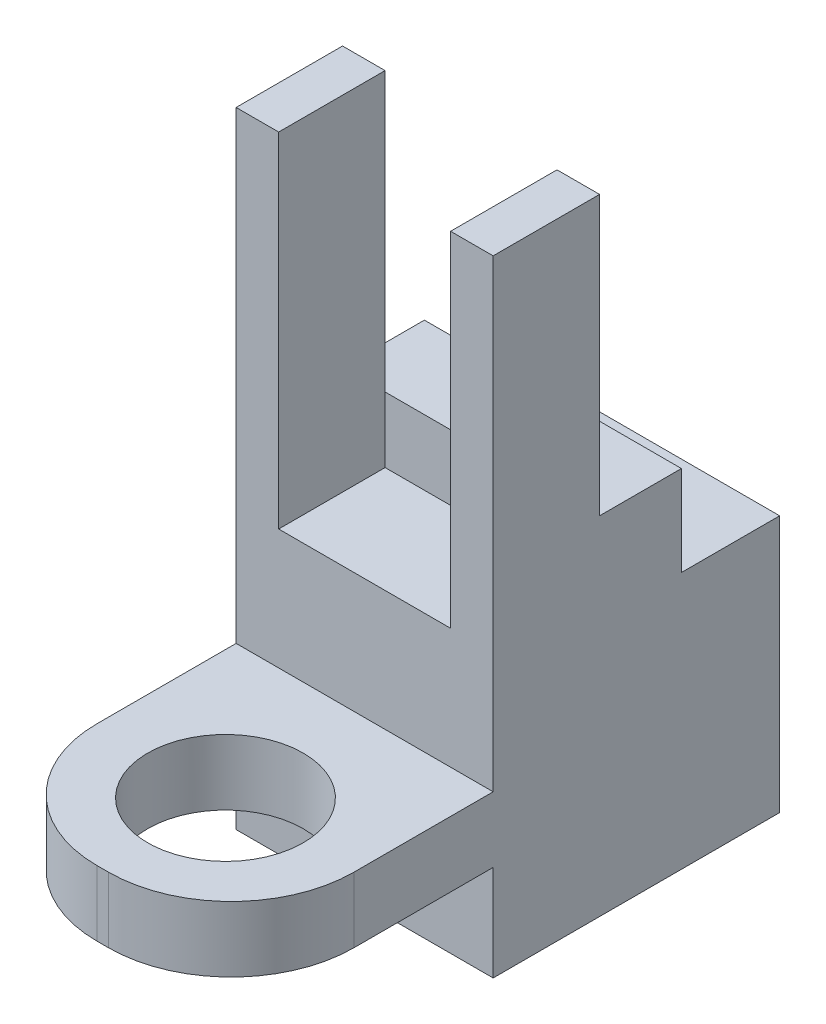
ISO-10303-21;
HEADER;
FILE_DESCRIPTION(('STEP AP214'),'2;1');
FILE_NAME('part.step','',(''),(''),'','','');
FILE_SCHEMA(('AUTOMOTIVE_DESIGN { 1 0 10303 214 1 1 1 1 }'));
ENDSEC;
DATA;
#1=APPLICATION_CONTEXT('core data for automotive mechanical design processes');
#2=APPLICATION_PROTOCOL_DEFINITION('international standard','automotive_design',2000,#1);
#3=PRODUCT_CONTEXT('',#1,'mechanical');
#4=PRODUCT('Part','Part','',(#3));
#5=PRODUCT_RELATED_PRODUCT_CATEGORY('part','',(#4));
#6=PRODUCT_DEFINITION_FORMATION('','',#4);
#7=PRODUCT_DEFINITION_CONTEXT('part definition',#1,'design');
#8=PRODUCT_DEFINITION('design','',#6,#7);
#9=PRODUCT_DEFINITION_SHAPE('','',#8);
#10=(LENGTH_UNIT() NAMED_UNIT(*) SI_UNIT(.MILLI.,.METRE.));
#11=(NAMED_UNIT(*) PLANE_ANGLE_UNIT() SI_UNIT($,.RADIAN.));
#12=(NAMED_UNIT(*) SI_UNIT($,.STERADIAN.) SOLID_ANGLE_UNIT());
#13=UNCERTAINTY_MEASURE_WITH_UNIT(LENGTH_MEASURE(1.E-05),#10,'distance_accuracy_value','');
#14=(GEOMETRIC_REPRESENTATION_CONTEXT(3) GLOBAL_UNCERTAINTY_ASSIGNED_CONTEXT((#13)) GLOBAL_UNIT_ASSIGNED_CONTEXT((#10,
#11,#12)) REPRESENTATION_CONTEXT('',''));
#15=CARTESIAN_POINT('',(0.,0.,0.));
#16=DIRECTION('',(0.,0.,1.));
#17=DIRECTION('',(1.,0.,0.));
#18=AXIS2_PLACEMENT_3D('',#15,#16,#17);
#19=CARTESIAN_POINT('',(15.7,26.7,22.));
#20=DIRECTION('',(0.,0.,-1.));
#21=DIRECTION('',(-1.,0.,0.));
#22=AXIS2_PLACEMENT_3D('',#19,#20,#21);
#23=PLANE('',#22);
#24=DIRECTION('',(0.,-1.,0.));
#25=VECTOR('',#24,1.);
#26=CARTESIAN_POINT('',(10.5,60.7,22.));
#27=LINE('',#26,#25);
#28=CARTESIAN_POINT('',(10.5,26.7,22.));
#29=VERTEX_POINT('',#28);
#30=CARTESIAN_POINT('',(10.5,18.7,22.));
#31=VERTEX_POINT('',#30);
#32=EDGE_CURVE('E239',#29,#31,#27,.T.);
#33=ORIENTED_EDGE('',*,*,#32,.F.);
#34=DIRECTION('',(1.,0.,0.));
#35=VECTOR('',#34,1.);
#36=CARTESIAN_POINT('',(15.7,26.7,22.));
#37=LINE('',#36,#35);
#38=CARTESIAN_POINT('',(-10.5,26.7,22.));
#39=VERTEX_POINT('',#38);
#40=EDGE_CURVE('E259',#39,#29,#37,.T.);
#41=ORIENTED_EDGE('',*,*,#40,.F.);
#42=DIRECTION('',(0.,-1.,0.));
#43=VECTOR('',#42,1.);
#44=CARTESIAN_POINT('',(-10.5,60.7,22.));
#45=LINE('',#44,#43);
#46=CARTESIAN_POINT('',(-10.5,18.7,22.));
#47=VERTEX_POINT('',#46);
#48=EDGE_CURVE('E252',#39,#47,#45,.T.);
#49=ORIENTED_EDGE('',*,*,#48,.T.);
#50=DIRECTION('',(-1.,0.,0.));
#51=VECTOR('',#50,1.);
#52=CARTESIAN_POINT('',(-10.5,18.7,22.));
#53=LINE('',#52,#51);
#54=EDGE_CURVE('E209',#31,#47,#53,.T.);
#55=ORIENTED_EDGE('',*,*,#54,.F.);
#56=EDGE_LOOP('',(#33,#41,#49,#55));
#57=FACE_BOUND('',#56,.T.);
#58=ADVANCED_FACE('F35',(#57),#23,.F.);
#59=CARTESIAN_POINT('',(-15.7,15.7,30.));
#60=DIRECTION('',(0.,-1.,0.));
#61=DIRECTION('',(0.,0.,-1.));
#62=AXIS2_PLACEMENT_3D('',#59,#60,#61);
#63=PLANE('',#62);
#64=DIRECTION('',(-1.,0.,0.));
#65=VECTOR('',#64,1.);
#66=CARTESIAN_POINT('',(-15.7,15.7,12.));
#67=LINE('',#66,#65);
#68=CARTESIAN_POINT('',(15.7,15.7,12.));
#69=VERTEX_POINT('',#68);
#70=CARTESIAN_POINT('',(-15.7,15.7,12.));
#71=VERTEX_POINT('',#70);
#72=EDGE_CURVE('E254',#69,#71,#67,.T.);
#73=ORIENTED_EDGE('',*,*,#72,.F.);
#74=DIRECTION('',(0.,0.,-1.));
#75=VECTOR('',#74,1.);
#76=CARTESIAN_POINT('',(15.7,15.7,30.));
#77=LINE('',#76,#75);
#78=CARTESIAN_POINT('',(15.7,15.7,0.));
#79=VERTEX_POINT('',#78);
#80=EDGE_CURVE('E373',#69,#79,#77,.T.);
#81=ORIENTED_EDGE('',*,*,#80,.T.);
#82=DIRECTION('',(-1.,0.,0.));
#83=VECTOR('',#82,1.);
#84=CARTESIAN_POINT('',(-15.7,15.7,0.));
#85=LINE('',#84,#83);
#86=CARTESIAN_POINT('',(-15.7,15.7,0.));
#87=VERTEX_POINT('',#86);
#88=EDGE_CURVE('E368',#79,#87,#85,.T.);
#89=ORIENTED_EDGE('',*,*,#88,.T.);
#90=DIRECTION('',(0.,0.,-1.));
#91=VECTOR('',#90,1.);
#92=CARTESIAN_POINT('',(-15.7,15.7,30.));
#93=LINE('',#92,#91);
#94=EDGE_CURVE('E371',#71,#87,#93,.T.);
#95=ORIENTED_EDGE('',*,*,#94,.F.);
#96=EDGE_LOOP('',(#73,#81,#89,#95));
#97=FACE_BOUND('',#96,.T.);
#98=ADVANCED_FACE('F390',(#97),#63,.F.);
#99=CARTESIAN_POINT('',(0.,0.,35.));
#100=DIRECTION('',(0.,0.,-1.));
#101=DIRECTION('',(-1.,0.,0.));
#102=AXIS2_PLACEMENT_3D('',#99,#100,#101);
#103=PLANE('',#102);
#104=DIRECTION('',(1.,0.,0.));
#105=VECTOR('',#104,1.);
#106=CARTESIAN_POINT('',(10.5,18.7,35.));
#107=LINE('',#106,#105);
#108=CARTESIAN_POINT('',(-10.5,18.7,35.));
#109=VERTEX_POINT('',#108);
#110=CARTESIAN_POINT('',(10.5,18.7,35.));
#111=VERTEX_POINT('',#110);
#112=EDGE_CURVE('E207',#109,#111,#107,.T.);
#113=ORIENTED_EDGE('',*,*,#112,.F.);
#114=DIRECTION('',(0.,1.,0.));
#115=VECTOR('',#114,1.);
#116=CARTESIAN_POINT('',(-10.5,60.7,35.));
#117=LINE('',#116,#115);
#118=CARTESIAN_POINT('',(-10.5,60.7,35.));
#119=VERTEX_POINT('',#118);
#120=EDGE_CURVE('E191',#109,#119,#117,.T.);
#121=ORIENTED_EDGE('',*,*,#120,.T.);
#122=DIRECTION('',(-1.,0.,0.));
#123=VECTOR('',#122,1.);
#124=CARTESIAN_POINT('',(-15.7,60.7,35.));
#125=LINE('',#124,#123);
#126=CARTESIAN_POINT('',(-15.7,60.7,35.));
#127=VERTEX_POINT('',#126);
#128=EDGE_CURVE('E200',#119,#127,#125,.T.);
#129=ORIENTED_EDGE('',*,*,#128,.T.);
#130=DIRECTION('',(0.,-1.,0.));
#131=VECTOR('',#130,1.);
#132=CARTESIAN_POINT('',(-15.7,-15.7,35.));
#133=LINE('',#132,#131);
#134=CARTESIAN_POINT('',(-15.7,4.,35.));
#135=VERTEX_POINT('',#134);
#136=EDGE_CURVE('E318',#127,#135,#133,.T.);
#137=ORIENTED_EDGE('',*,*,#136,.T.);
#138=DIRECTION('',(-1.,0.,0.));
#139=VECTOR('',#138,1.);
#140=CARTESIAN_POINT('',(-15.7,4.,35.));
#141=LINE('',#140,#139);
#142=CARTESIAN_POINT('',(15.7,4.,35.));
#143=VERTEX_POINT('',#142);
#144=EDGE_CURVE('E58',#143,#135,#141,.T.);
#145=ORIENTED_EDGE('',*,*,#144,.F.);
#146=DIRECTION('',(0.,1.,0.));
#147=VECTOR('',#146,1.);
#148=CARTESIAN_POINT('',(15.7,15.7,35.));
#149=LINE('',#148,#147);
#150=CARTESIAN_POINT('',(15.7,60.7,35.));
#151=VERTEX_POINT('',#150);
#152=EDGE_CURVE('E323',#143,#151,#149,.T.);
#153=ORIENTED_EDGE('',*,*,#152,.T.);
#154=DIRECTION('',(-1.,0.,0.));
#155=VECTOR('',#154,1.);
#156=CARTESIAN_POINT('',(10.5,60.7,35.));
#157=LINE('',#156,#155);
#158=CARTESIAN_POINT('',(10.5,60.7,35.));
#159=VERTEX_POINT('',#158);
#160=EDGE_CURVE('E226',#151,#159,#157,.T.);
#161=ORIENTED_EDGE('',*,*,#160,.T.);
#162=DIRECTION('',(0.,-1.,0.));
#163=VECTOR('',#162,1.);
#164=CARTESIAN_POINT('',(10.5,20.7,35.));
#165=LINE('',#164,#163);
#166=EDGE_CURVE('E201',#159,#111,#165,.T.);
#167=ORIENTED_EDGE('',*,*,#166,.T.);
#168=EDGE_LOOP('',(#113,#121,#129,#137,#145,#153,#161,#167));
#169=FACE_BOUND('',#168,.T.);
#170=ADVANCED_FACE('F211',(#169),#103,.F.);
#171=DIRECTION('',(1.,0.,0.));
#172=VECTOR('',#171,1.);
#173=CARTESIAN_POINT('',(15.7,-4.,35.));
#174=LINE('',#173,#172);
#175=CARTESIAN_POINT('',(-15.7,-4.,35.));
#176=VERTEX_POINT('',#175);
#177=CARTESIAN_POINT('',(15.7,-4.,35.));
#178=VERTEX_POINT('',#177);
#179=EDGE_CURVE('E295',#176,#178,#174,.T.);
#180=ORIENTED_EDGE('',*,*,#179,.F.);
#181=CARTESIAN_POINT('',(-15.7,-15.7,35.));
#182=VERTEX_POINT('',#181);
#183=EDGE_CURVE('E317',#176,#182,#133,.T.);
#184=ORIENTED_EDGE('',*,*,#183,.T.);
#185=DIRECTION('',(1.,0.,0.));
#186=VECTOR('',#185,1.);
#187=CARTESIAN_POINT('',(15.7,-15.7,35.));
#188=LINE('',#187,#186);
#189=CARTESIAN_POINT('',(15.7,-15.7,35.));
#190=VERTEX_POINT('',#189);
#191=EDGE_CURVE('E320',#182,#190,#188,.T.);
#192=ORIENTED_EDGE('',*,*,#191,.T.);
#193=EDGE_CURVE('E324',#190,#178,#149,.T.);
#194=ORIENTED_EDGE('',*,*,#193,.T.);
#195=EDGE_LOOP('',(#180,#184,#192,#194));
#196=FACE_BOUND('',#195,.T.);
#197=ADVANCED_FACE('F474',(#196),#103,.F.);
#198=CARTESIAN_POINT('',(0.,0.,0.));
#199=DIRECTION('',(0.,0.,1.));
#200=DIRECTION('',(1.,0.,0.));
#201=AXIS2_PLACEMENT_3D('',#198,#199,#200);
#202=PLANE('',#201);
#203=DIRECTION('',(0.,-1.,0.));
#204=VECTOR('',#203,1.);
#205=CARTESIAN_POINT('',(-15.7,15.7,0.));
#206=LINE('',#205,#204);
#207=CARTESIAN_POINT('',(-15.7,-15.7,0.));
#208=VERTEX_POINT('',#207);
#209=EDGE_CURVE('E360',#87,#208,#206,.T.);
#210=ORIENTED_EDGE('',*,*,#209,.F.);
#211=ORIENTED_EDGE('',*,*,#88,.F.);
#212=DIRECTION('',(0.,1.,0.));
#213=VECTOR('',#212,1.);
#214=CARTESIAN_POINT('',(15.7,15.7,0.));
#215=LINE('',#214,#213);
#216=CARTESIAN_POINT('',(15.7,-15.7,0.));
#217=VERTEX_POINT('',#216);
#218=EDGE_CURVE('E365',#217,#79,#215,.T.);
#219=ORIENTED_EDGE('',*,*,#218,.F.);
#220=DIRECTION('',(1.,0.,0.));
#221=VECTOR('',#220,1.);
#222=CARTESIAN_POINT('',(-15.7,-15.7,0.));
#223=LINE('',#222,#221);
#224=EDGE_CURVE('E363',#208,#217,#223,.T.);
#225=ORIENTED_EDGE('',*,*,#224,.F.);
#226=EDGE_LOOP('',(#210,#211,#219,#225));
#227=FACE_BOUND('',#226,.T.);
#228=DIRECTION('',(-1.,0.,0.));
#229=VECTOR('',#228,1.);
#230=CARTESIAN_POINT('',(-12.7,12.7,0.));
#231=LINE('',#230,#229);
#232=CARTESIAN_POINT('',(12.7,12.7,0.));
#233=VERTEX_POINT('',#232);
#234=CARTESIAN_POINT('',(-12.7,12.7,0.));
#235=VERTEX_POINT('',#234);
#236=EDGE_CURVE('E326',#233,#235,#231,.T.);
#237=ORIENTED_EDGE('',*,*,#236,.T.);
#238=DIRECTION('',(0.,-1.,0.));
#239=VECTOR('',#238,1.);
#240=CARTESIAN_POINT('',(-12.7,12.7,0.));
#241=LINE('',#240,#239);
#242=CARTESIAN_POINT('',(-12.7,-12.7,0.));
#243=VERTEX_POINT('',#242);
#244=EDGE_CURVE('E343',#235,#243,#241,.T.);
#245=ORIENTED_EDGE('',*,*,#244,.T.);
#246=DIRECTION('',(1.,0.,0.));
#247=VECTOR('',#246,1.);
#248=CARTESIAN_POINT('',(-12.7,-12.7,0.));
#249=LINE('',#248,#247);
#250=CARTESIAN_POINT('',(12.7,-12.7,0.));
#251=VERTEX_POINT('',#250);
#252=EDGE_CURVE('E346',#243,#251,#249,.T.);
#253=ORIENTED_EDGE('',*,*,#252,.T.);
#254=DIRECTION('',(0.,1.,0.));
#255=VECTOR('',#254,1.);
#256=CARTESIAN_POINT('',(12.7,12.7,0.));
#257=LINE('',#256,#255);
#258=EDGE_CURVE('E331',#251,#233,#257,.T.);
#259=ORIENTED_EDGE('',*,*,#258,.T.);
#260=EDGE_LOOP('',(#237,#245,#253,#259));
#261=FACE_BOUND('',#260,.T.);
#262=ADVANCED_FACE('F385',(#227,#261),#202,.F.);
#263=CARTESIAN_POINT('',(-15.7,15.7,30.));
#264=DIRECTION('',(1.,0.,0.));
#265=DIRECTION('',(0.,1.,0.));
#266=AXIS2_PLACEMENT_3D('',#263,#264,#265);
#267=PLANE('',#266);
#268=ORIENTED_EDGE('',*,*,#136,.F.);
#269=DIRECTION('',(0.,0.,1.));
#270=VECTOR('',#269,1.);
#271=CARTESIAN_POINT('',(-15.7,60.7,32.));
#272=LINE('',#271,#270);
#273=CARTESIAN_POINT('',(-15.7,60.7,22.));
#274=VERTEX_POINT('',#273);
#275=EDGE_CURVE('E243',#274,#127,#272,.T.);
#276=ORIENTED_EDGE('',*,*,#275,.F.);
#277=DIRECTION('',(0.,-1.,0.));
#278=VECTOR('',#277,1.);
#279=CARTESIAN_POINT('',(-15.7,60.7,22.));
#280=LINE('',#279,#278);
#281=CARTESIAN_POINT('',(-15.7,26.7,22.));
#282=VERTEX_POINT('',#281);
#283=EDGE_CURVE('E249',#274,#282,#280,.T.);
#284=ORIENTED_EDGE('',*,*,#283,.T.);
#285=DIRECTION('',(0.,0.,1.));
#286=VECTOR('',#285,1.);
#287=CARTESIAN_POINT('',(-15.7,26.7,22.));
#288=LINE('',#287,#286);
#289=CARTESIAN_POINT('',(-15.7,26.7,12.));
#290=VERTEX_POINT('',#289);
#291=EDGE_CURVE('E264',#290,#282,#288,.T.);
#292=ORIENTED_EDGE('',*,*,#291,.F.);
#293=DIRECTION('',(0.,-1.,0.));
#294=VECTOR('',#293,1.);
#295=CARTESIAN_POINT('',(-15.7,26.7,12.));
#296=LINE('',#295,#294);
#297=EDGE_CURVE('E267',#290,#71,#296,.T.);
#298=ORIENTED_EDGE('',*,*,#297,.T.);
#299=ORIENTED_EDGE('',*,*,#94,.T.);
#300=ORIENTED_EDGE('',*,*,#209,.T.);
#301=DIRECTION('',(0.,0.,-1.));
#302=VECTOR('',#301,1.);
#303=CARTESIAN_POINT('',(-15.7,-15.7,30.));
#304=LINE('',#303,#302);
#305=EDGE_CURVE('E11',#182,#208,#304,.T.);
#306=ORIENTED_EDGE('',*,*,#305,.F.);
#307=ORIENTED_EDGE('',*,*,#183,.F.);
#308=DIRECTION('',(0.,0.,-1.));
#309=VECTOR('',#308,1.);
#310=CARTESIAN_POINT('',(-15.7,-4.,40.));
#311=LINE('',#310,#309);
#312=CARTESIAN_POINT('',(-15.7,-4.,52.));
#313=VERTEX_POINT('',#312);
#314=EDGE_CURVE('E314',#313,#176,#311,.T.);
#315=ORIENTED_EDGE('',*,*,#314,.F.);
#316=DIRECTION('',(0.,-1.,0.));
#317=VECTOR('',#316,1.);
#318=CARTESIAN_POINT('',(-15.7,4.,52.));
#319=LINE('',#318,#317);
#320=CARTESIAN_POINT('',(-15.7,4.,52.));
#321=VERTEX_POINT('',#320);
#322=EDGE_CURVE('E292',#321,#313,#319,.T.);
#323=ORIENTED_EDGE('',*,*,#322,.F.);
#324=DIRECTION('',(0.,0.,-1.));
#325=VECTOR('',#324,1.);
#326=CARTESIAN_POINT('',(-15.7,4.,40.));
#327=LINE('',#326,#325);
#328=EDGE_CURVE('E305',#321,#135,#327,.T.);
#329=ORIENTED_EDGE('',*,*,#328,.T.);
#330=EDGE_LOOP('',(#268,#276,#284,#292,#298,#299,#300,#306,#307,#315,#323,#329));
#331=FACE_BOUND('',#330,.T.);
#332=ADVANCED_FACE('F37',(#331),#267,.F.);
#333=CARTESIAN_POINT('',(-15.7,-15.7,30.));
#334=DIRECTION('',(0.,1.,0.));
#335=DIRECTION('',(0.,0.,1.));
#336=AXIS2_PLACEMENT_3D('',#333,#334,#335);
#337=PLANE('',#336);
#338=ORIENTED_EDGE('',*,*,#224,.T.);
#339=DIRECTION('',(0.,0.,-1.));
#340=VECTOR('',#339,1.);
#341=CARTESIAN_POINT('',(15.7,-15.7,30.));
#342=LINE('',#341,#340);
#343=EDGE_CURVE('E43',#190,#217,#342,.T.);
#344=ORIENTED_EDGE('',*,*,#343,.F.);
#345=ORIENTED_EDGE('',*,*,#191,.F.);
#346=ORIENTED_EDGE('',*,*,#305,.T.);
#347=EDGE_LOOP('',(#338,#344,#345,#346));
#348=FACE_BOUND('',#347,.T.);
#349=ADVANCED_FACE('F497',(#348),#337,.F.);
#350=CARTESIAN_POINT('',(15.7,15.7,30.));
#351=DIRECTION('',(-1.,0.,0.));
#352=DIRECTION('',(0.,-1.,0.));
#353=AXIS2_PLACEMENT_3D('',#350,#351,#352);
#354=PLANE('',#353);
#355=ORIENTED_EDGE('',*,*,#80,.F.);
#356=DIRECTION('',(0.,-1.,0.));
#357=VECTOR('',#356,1.);
#358=CARTESIAN_POINT('',(15.7,26.7,12.));
#359=LINE('',#358,#357);
#360=CARTESIAN_POINT('',(15.7,26.7,12.));
#361=VERTEX_POINT('',#360);
#362=EDGE_CURVE('E271',#361,#69,#359,.T.);
#363=ORIENTED_EDGE('',*,*,#362,.F.);
#364=DIRECTION('',(0.,0.,-1.));
#365=VECTOR('',#364,1.);
#366=CARTESIAN_POINT('',(15.7,26.7,12.));
#367=LINE('',#366,#365);
#368=CARTESIAN_POINT('',(15.7,26.7,22.));
#369=VERTEX_POINT('',#368);
#370=EDGE_CURVE('E258',#369,#361,#367,.T.);
#371=ORIENTED_EDGE('',*,*,#370,.F.);
#372=DIRECTION('',(0.,-1.,0.));
#373=VECTOR('',#372,1.);
#374=CARTESIAN_POINT('',(15.7,60.7,22.));
#375=LINE('',#374,#373);
#376=CARTESIAN_POINT('',(15.7,60.7,22.));
#377=VERTEX_POINT('',#376);
#378=EDGE_CURVE('E237',#377,#369,#375,.T.);
#379=ORIENTED_EDGE('',*,*,#378,.F.);
#380=DIRECTION('',(0.,0.,-1.));
#381=VECTOR('',#380,1.);
#382=CARTESIAN_POINT('',(15.7,60.7,32.));
#383=LINE('',#382,#381);
#384=EDGE_CURVE('E235',#151,#377,#383,.T.);
#385=ORIENTED_EDGE('',*,*,#384,.F.);
#386=ORIENTED_EDGE('',*,*,#152,.F.);
#387=DIRECTION('',(0.,0.,-1.));
#388=VECTOR('',#387,1.);
#389=CARTESIAN_POINT('',(15.7,4.,40.));
#390=LINE('',#389,#388);
#391=CARTESIAN_POINT('',(15.7,4.,52.));
#392=VERTEX_POINT('',#391);
#393=EDGE_CURVE('E308',#392,#143,#390,.T.);
#394=ORIENTED_EDGE('',*,*,#393,.F.);
#395=DIRECTION('',(0.,-1.,0.));
#396=VECTOR('',#395,1.);
#397=CARTESIAN_POINT('',(15.7,4.,52.));
#398=LINE('',#397,#396);
#399=CARTESIAN_POINT('',(15.7,-4.,52.));
#400=VERTEX_POINT('',#399);
#401=EDGE_CURVE('E284',#392,#400,#398,.T.);
#402=ORIENTED_EDGE('',*,*,#401,.T.);
#403=DIRECTION('',(0.,0.,-1.));
#404=VECTOR('',#403,1.);
#405=CARTESIAN_POINT('',(15.7,-4.,40.));
#406=LINE('',#405,#404);
#407=EDGE_CURVE('E311',#400,#178,#406,.T.);
#408=ORIENTED_EDGE('',*,*,#407,.T.);
#409=ORIENTED_EDGE('',*,*,#193,.F.);
#410=ORIENTED_EDGE('',*,*,#343,.T.);
#411=ORIENTED_EDGE('',*,*,#218,.T.);
#412=EDGE_LOOP('',(#355,#363,#371,#379,#385,#386,#394,#402,#408,#409,#410,#411));
#413=FACE_BOUND('',#412,.T.);
#414=ADVANCED_FACE('F379',(#413),#354,.F.);
#415=CARTESIAN_POINT('',(-12.7,12.7,30.));
#416=DIRECTION('',(0.,-1.,0.));
#417=DIRECTION('',(0.,0.,-1.));
#418=AXIS2_PLACEMENT_3D('',#415,#416,#417);
#419=PLANE('',#418);
#420=ORIENTED_EDGE('',*,*,#236,.F.);
#421=DIRECTION('',(0.,0.,-1.));
#422=VECTOR('',#421,1.);
#423=CARTESIAN_POINT('',(12.7,12.7,30.));
#424=LINE('',#423,#422);
#425=CARTESIAN_POINT('',(12.7,12.7,30.));
#426=VERTEX_POINT('',#425);
#427=EDGE_CURVE('E340',#426,#233,#424,.T.);
#428=ORIENTED_EDGE('',*,*,#427,.F.);
#429=DIRECTION('',(-1.,0.,0.));
#430=VECTOR('',#429,1.);
#431=CARTESIAN_POINT('',(-12.7,12.7,30.));
#432=LINE('',#431,#430);
#433=CARTESIAN_POINT('',(-12.7,12.7,30.));
#434=VERTEX_POINT('',#433);
#435=EDGE_CURVE('E327',#426,#434,#432,.T.);
#436=ORIENTED_EDGE('',*,*,#435,.T.);
#437=DIRECTION('',(0.,0.,-1.));
#438=VECTOR('',#437,1.);
#439=CARTESIAN_POINT('',(-12.7,12.7,30.));
#440=LINE('',#439,#438);
#441=EDGE_CURVE('E357',#434,#235,#440,.T.);
#442=ORIENTED_EDGE('',*,*,#441,.T.);
#443=EDGE_LOOP('',(#420,#428,#436,#442));
#444=FACE_BOUND('',#443,.T.);
#445=ADVANCED_FACE('F489',(#444),#419,.T.);
#446=CARTESIAN_POINT('',(-12.7,12.7,30.));
#447=DIRECTION('',(1.,0.,0.));
#448=DIRECTION('',(0.,1.,0.));
#449=AXIS2_PLACEMENT_3D('',#446,#447,#448);
#450=PLANE('',#449);
#451=ORIENTED_EDGE('',*,*,#244,.F.);
#452=ORIENTED_EDGE('',*,*,#441,.F.);
#453=DIRECTION('',(0.,-1.,0.));
#454=VECTOR('',#453,1.);
#455=CARTESIAN_POINT('',(-12.7,12.7,30.));
#456=LINE('',#455,#454);
#457=CARTESIAN_POINT('',(-12.7,-12.7,30.));
#458=VERTEX_POINT('',#457);
#459=EDGE_CURVE('E330',#434,#458,#456,.T.);
#460=ORIENTED_EDGE('',*,*,#459,.T.);
#461=DIRECTION('',(0.,0.,-1.));
#462=VECTOR('',#461,1.);
#463=CARTESIAN_POINT('',(-12.7,-12.7,30.));
#464=LINE('',#463,#462);
#465=EDGE_CURVE('E355',#458,#243,#464,.T.);
#466=ORIENTED_EDGE('',*,*,#465,.T.);
#467=EDGE_LOOP('',(#451,#452,#460,#466));
#468=FACE_BOUND('',#467,.T.);
#469=ADVANCED_FACE('F485',(#468),#450,.T.);
#470=CARTESIAN_POINT('',(-12.7,-12.7,30.));
#471=DIRECTION('',(0.,1.,0.));
#472=DIRECTION('',(0.,0.,1.));
#473=AXIS2_PLACEMENT_3D('',#470,#471,#472);
#474=PLANE('',#473);
#475=ORIENTED_EDGE('',*,*,#252,.F.);
#476=ORIENTED_EDGE('',*,*,#465,.F.);
#477=DIRECTION('',(1.,0.,0.));
#478=VECTOR('',#477,1.);
#479=CARTESIAN_POINT('',(-12.7,-12.7,30.));
#480=LINE('',#479,#478);
#481=CARTESIAN_POINT('',(12.7,-12.7,30.));
#482=VERTEX_POINT('',#481);
#483=EDGE_CURVE('E334',#458,#482,#480,.T.);
#484=ORIENTED_EDGE('',*,*,#483,.T.);
#485=DIRECTION('',(0.,0.,-1.));
#486=VECTOR('',#485,1.);
#487=CARTESIAN_POINT('',(12.7,-12.7,30.));
#488=LINE('',#487,#486);
#489=EDGE_CURVE('E353',#482,#251,#488,.T.);
#490=ORIENTED_EDGE('',*,*,#489,.T.);
#491=EDGE_LOOP('',(#475,#476,#484,#490));
#492=FACE_BOUND('',#491,.T.);
#493=ADVANCED_FACE('F481',(#492),#474,.T.);
#494=CARTESIAN_POINT('',(12.7,12.7,30.));
#495=DIRECTION('',(-1.,0.,0.));
#496=DIRECTION('',(0.,-1.,0.));
#497=AXIS2_PLACEMENT_3D('',#494,#495,#496);
#498=PLANE('',#497);
#499=ORIENTED_EDGE('',*,*,#258,.F.);
#500=ORIENTED_EDGE('',*,*,#489,.F.);
#501=DIRECTION('',(0.,1.,0.));
#502=VECTOR('',#501,1.);
#503=CARTESIAN_POINT('',(12.7,12.7,30.));
#504=LINE('',#503,#502);
#505=EDGE_CURVE('E337',#482,#426,#504,.T.);
#506=ORIENTED_EDGE('',*,*,#505,.T.);
#507=ORIENTED_EDGE('',*,*,#427,.T.);
#508=EDGE_LOOP('',(#499,#500,#506,#507));
#509=FACE_BOUND('',#508,.T.);
#510=ADVANCED_FACE('F477',(#509),#498,.T.);
#511=CARTESIAN_POINT('',(0.,0.,30.));
#512=DIRECTION('',(0.,0.,-1.));
#513=DIRECTION('',(-1.,0.,0.));
#514=AXIS2_PLACEMENT_3D('',#511,#512,#513);
#515=PLANE('',#514);
#516=ORIENTED_EDGE('',*,*,#459,.F.);
#517=ORIENTED_EDGE('',*,*,#435,.F.);
#518=ORIENTED_EDGE('',*,*,#505,.F.);
#519=ORIENTED_EDGE('',*,*,#483,.F.);
#520=EDGE_LOOP('',(#516,#517,#518,#519));
#521=FACE_BOUND('',#520,.T.);
#522=ADVANCED_FACE('F470',(#521),#515,.T.);
#523=CARTESIAN_POINT('',(15.7,-4.,40.));
#524=DIRECTION('',(0.,1.,0.));
#525=DIRECTION('',(-1.,0.,0.));
#526=AXIS2_PLACEMENT_3D('',#523,#524,#525);
#527=PLANE('',#526);
#528=CARTESIAN_POINT('',(0.,-4.00000000000001,52.));
#529=DIRECTION('',(0.,1.,0.));
#530=DIRECTION('',(-1.,0.,0.));
#531=AXIS2_PLACEMENT_3D('',#528,#529,#530);
#532=CIRCLE('',#531,9.5);
#533=CARTESIAN_POINT('',(-9.5,-4.00000000000001,52.));
#534=VERTEX_POINT('',#533);
#535=EDGE_CURVE('E223',#534,#534,#532,.T.);
#536=ORIENTED_EDGE('',*,*,#535,.T.);
#537=EDGE_LOOP('',(#536));
#538=FACE_BOUND('',#537,.T.);
#539=ORIENTED_EDGE('',*,*,#179,.T.);
#540=ORIENTED_EDGE('',*,*,#407,.F.);
#541=CARTESIAN_POINT('',(0.699999999999999,-4.,52.));
#542=DIRECTION('',(0.,-1.,0.));
#543=DIRECTION('',(-1.,0.,0.));
#544=AXIS2_PLACEMENT_3D('',#541,#542,#543);
#545=CIRCLE('',#544,15.);
#546=CARTESIAN_POINT('',(0.699999999999999,-4.,67.));
#547=VERTEX_POINT('',#546);
#548=EDGE_CURVE('E273',#400,#547,#545,.T.);
#549=ORIENTED_EDGE('',*,*,#548,.T.);
#550=DIRECTION('',(-1.,0.,0.));
#551=VECTOR('',#550,1.);
#552=CARTESIAN_POINT('',(-0.699999999999992,-4.,67.));
#553=LINE('',#552,#551);
#554=CARTESIAN_POINT('',(-0.699999999999993,-4.,67.));
#555=VERTEX_POINT('',#554);
#556=EDGE_CURVE('E287',#547,#555,#553,.T.);
#557=ORIENTED_EDGE('',*,*,#556,.T.);
#558=CARTESIAN_POINT('',(-0.699999999999992,-4.,52.));
#559=DIRECTION('',(0.,-1.,0.));
#560=DIRECTION('',(-1.,0.,0.));
#561=AXIS2_PLACEMENT_3D('',#558,#559,#560);
#562=CIRCLE('',#561,15.);
#563=EDGE_CURVE('E278',#555,#313,#562,.T.);
#564=ORIENTED_EDGE('',*,*,#563,.T.);
#565=ORIENTED_EDGE('',*,*,#314,.T.);
#566=EDGE_LOOP('',(#539,#540,#549,#557,#564,#565));
#567=FACE_BOUND('',#566,.T.);
#568=ADVANCED_FACE('F466',(#538,#567),#527,.F.);
#569=CARTESIAN_POINT('',(-15.7,4.,40.));
#570=DIRECTION('',(0.,-1.,0.));
#571=DIRECTION('',(0.,0.,-1.));
#572=AXIS2_PLACEMENT_3D('',#569,#570,#571);
#573=PLANE('',#572);
#574=CARTESIAN_POINT('',(0.,4.,52.));
#575=DIRECTION('',(0.,-1.,0.));
#576=DIRECTION('',(0.,0.,-1.));
#577=AXIS2_PLACEMENT_3D('',#574,#575,#576);
#578=CIRCLE('',#577,9.5);
#579=CARTESIAN_POINT('',(0.,4.,42.5));
#580=VERTEX_POINT('',#579);
#581=EDGE_CURVE('E220',#580,#580,#578,.T.);
#582=ORIENTED_EDGE('',*,*,#581,.T.);
#583=EDGE_LOOP('',(#582));
#584=FACE_BOUND('',#583,.T.);
#585=ORIENTED_EDGE('',*,*,#144,.T.);
#586=ORIENTED_EDGE('',*,*,#328,.F.);
#587=CARTESIAN_POINT('',(-0.699999999999993,4.,52.));
#588=DIRECTION('',(0.,-1.,0.));
#589=DIRECTION('',(-1.,0.,0.));
#590=AXIS2_PLACEMENT_3D('',#587,#588,#589);
#591=CIRCLE('',#590,15.);
#592=CARTESIAN_POINT('',(-0.699999999999994,4.,67.));
#593=VERTEX_POINT('',#592);
#594=EDGE_CURVE('E281',#593,#321,#591,.T.);
#595=ORIENTED_EDGE('',*,*,#594,.F.);
#596=DIRECTION('',(-1.,0.,0.));
#597=VECTOR('',#596,1.);
#598=CARTESIAN_POINT('',(-0.699999999999993,4.,67.));
#599=LINE('',#598,#597);
#600=CARTESIAN_POINT('',(0.699999999999998,4.,67.));
#601=VERTEX_POINT('',#600);
#602=EDGE_CURVE('E277',#601,#593,#599,.T.);
#603=ORIENTED_EDGE('',*,*,#602,.F.);
#604=CARTESIAN_POINT('',(0.699999999999998,4.,52.));
#605=DIRECTION('',(0.,-1.,0.));
#606=DIRECTION('',(-1.,0.,0.));
#607=AXIS2_PLACEMENT_3D('',#604,#605,#606);
#608=CIRCLE('',#607,15.);
#609=EDGE_CURVE('E274',#392,#601,#608,.T.);
#610=ORIENTED_EDGE('',*,*,#609,.F.);
#611=ORIENTED_EDGE('',*,*,#393,.T.);
#612=EDGE_LOOP('',(#585,#586,#595,#603,#610,#611));
#613=FACE_BOUND('',#612,.T.);
#614=ADVANCED_FACE('F419',(#584,#613),#573,.F.);
#615=CARTESIAN_POINT('',(-0.699999999999993,4.,52.));
#616=DIRECTION('',(0.,-1.,0.));
#617=DIRECTION('',(1.,0.,0.));
#618=AXIS2_PLACEMENT_3D('',#615,#616,#617);
#619=CYLINDRICAL_SURFACE('',#618,15.);
#620=ORIENTED_EDGE('',*,*,#563,.F.);
#621=DIRECTION('',(0.,-1.,0.));
#622=VECTOR('',#621,1.);
#623=CARTESIAN_POINT('',(-0.699999999999994,4.,67.));
#624=LINE('',#623,#622);
#625=EDGE_CURVE('E296',#593,#555,#624,.T.);
#626=ORIENTED_EDGE('',*,*,#625,.F.);
#627=ORIENTED_EDGE('',*,*,#594,.T.);
#628=ORIENTED_EDGE('',*,*,#322,.T.);
#629=EDGE_LOOP('',(#620,#626,#627,#628));
#630=FACE_BOUND('',#629,.T.);
#631=ADVANCED_FACE('F426',(#630),#619,.T.);
#632=CARTESIAN_POINT('',(-0.699999999999993,4.,67.));
#633=DIRECTION('',(0.,0.,1.));
#634=DIRECTION('',(1.,0.,0.));
#635=AXIS2_PLACEMENT_3D('',#632,#633,#634);
#636=PLANE('',#635);
#637=ORIENTED_EDGE('',*,*,#556,.F.);
#638=DIRECTION('',(0.,-1.,0.));
#639=VECTOR('',#638,1.);
#640=CARTESIAN_POINT('',(0.699999999999998,4.,67.));
#641=LINE('',#640,#639);
#642=EDGE_CURVE('E298',#601,#547,#641,.T.);
#643=ORIENTED_EDGE('',*,*,#642,.F.);
#644=ORIENTED_EDGE('',*,*,#602,.T.);
#645=ORIENTED_EDGE('',*,*,#625,.T.);
#646=EDGE_LOOP('',(#637,#643,#644,#645));
#647=FACE_BOUND('',#646,.T.);
#648=ADVANCED_FACE('F430',(#647),#636,.T.);
#649=CARTESIAN_POINT('',(0.699999999999998,4.,52.));
#650=DIRECTION('',(0.,-1.,0.));
#651=DIRECTION('',(1.,0.,0.));
#652=AXIS2_PLACEMENT_3D('',#649,#650,#651);
#653=CYLINDRICAL_SURFACE('',#652,15.);
#654=ORIENTED_EDGE('',*,*,#548,.F.);
#655=ORIENTED_EDGE('',*,*,#401,.F.);
#656=ORIENTED_EDGE('',*,*,#609,.T.);
#657=ORIENTED_EDGE('',*,*,#642,.T.);
#658=EDGE_LOOP('',(#654,#655,#656,#657));
#659=FACE_BOUND('',#658,.T.);
#660=ADVANCED_FACE('F433',(#659),#653,.T.);
#661=CARTESIAN_POINT('',(-15.7,26.7,12.));
#662=DIRECTION('',(0.,0.,1.));
#663=DIRECTION('',(1.,0.,0.));
#664=AXIS2_PLACEMENT_3D('',#661,#662,#663);
#665=PLANE('',#664);
#666=ORIENTED_EDGE('',*,*,#72,.T.);
#667=ORIENTED_EDGE('',*,*,#297,.F.);
#668=DIRECTION('',(-1.,0.,0.));
#669=VECTOR('',#668,1.);
#670=CARTESIAN_POINT('',(-15.7,26.7,12.));
#671=LINE('',#670,#669);
#672=EDGE_CURVE('E262',#361,#290,#671,.T.);
#673=ORIENTED_EDGE('',*,*,#672,.F.);
#674=ORIENTED_EDGE('',*,*,#362,.T.);
#675=EDGE_LOOP('',(#666,#667,#673,#674));
#676=FACE_BOUND('',#675,.T.);
#677=ADVANCED_FACE('F397',(#676),#665,.F.);
#678=CARTESIAN_POINT('',(0.,26.7,0.));
#679=DIRECTION('',(0.,-1.,0.));
#680=DIRECTION('',(0.,0.,-1.));
#681=AXIS2_PLACEMENT_3D('',#678,#679,#680);
#682=PLANE('',#681);
#683=EDGE_CURVE('E255',#282,#39,#37,.T.);
#684=ORIENTED_EDGE('',*,*,#683,.T.);
#685=ORIENTED_EDGE('',*,*,#40,.T.);
#686=EDGE_CURVE('E260',#29,#369,#37,.T.);
#687=ORIENTED_EDGE('',*,*,#686,.T.);
#688=ORIENTED_EDGE('',*,*,#370,.T.);
#689=ORIENTED_EDGE('',*,*,#672,.T.);
#690=ORIENTED_EDGE('',*,*,#291,.T.);
#691=EDGE_LOOP('',(#684,#685,#687,#688,#689,#690));
#692=FACE_BOUND('',#691,.T.);
#693=ADVANCED_FACE('F400',(#692),#682,.F.);
#694=CARTESIAN_POINT('',(-15.7,60.7,22.));
#695=DIRECTION('',(0.,0.,1.));
#696=DIRECTION('',(1.,0.,0.));
#697=AXIS2_PLACEMENT_3D('',#694,#695,#696);
#698=PLANE('',#697);
#699=CARTESIAN_POINT('',(-10.5,60.7,22.));
#700=VERTEX_POINT('',#699);
#701=EDGE_CURVE('E50',#700,#39,#45,.T.);
#702=ORIENTED_EDGE('',*,*,#701,.T.);
#703=ORIENTED_EDGE('',*,*,#683,.F.);
#704=ORIENTED_EDGE('',*,*,#283,.F.);
#705=DIRECTION('',(-1.,0.,0.));
#706=VECTOR('',#705,1.);
#707=CARTESIAN_POINT('',(-15.7,60.7,22.));
#708=LINE('',#707,#706);
#709=EDGE_CURVE('E247',#700,#274,#708,.T.);
#710=ORIENTED_EDGE('',*,*,#709,.F.);
#711=EDGE_LOOP('',(#702,#703,#704,#710));
#712=FACE_BOUND('',#711,.T.);
#713=ADVANCED_FACE('F413',(#712),#698,.F.);
#714=CARTESIAN_POINT('',(-10.5,60.7,22.));
#715=DIRECTION('',(-1.,0.,0.));
#716=DIRECTION('',(0.,0.,1.));
#717=AXIS2_PLACEMENT_3D('',#714,#715,#716);
#718=PLANE('',#717);
#719=ORIENTED_EDGE('',*,*,#120,.F.);
#720=DIRECTION('',(0.,0.,1.));
#721=VECTOR('',#720,1.);
#722=CARTESIAN_POINT('',(-10.5,18.7,35.));
#723=LINE('',#722,#721);
#724=EDGE_CURVE('E194',#47,#109,#723,.T.);
#725=ORIENTED_EDGE('',*,*,#724,.F.);
#726=ORIENTED_EDGE('',*,*,#48,.F.);
#727=ORIENTED_EDGE('',*,*,#701,.F.);
#728=DIRECTION('',(0.,0.,-1.));
#729=VECTOR('',#728,1.);
#730=CARTESIAN_POINT('',(-10.5,60.7,22.));
#731=LINE('',#730,#729);
#732=EDGE_CURVE('E196',#119,#700,#731,.T.);
#733=ORIENTED_EDGE('',*,*,#732,.F.);
#734=EDGE_LOOP('',(#719,#725,#726,#727,#733));
#735=FACE_BOUND('',#734,.T.);
#736=ADVANCED_FACE('F193',(#735),#718,.F.);
#737=CARTESIAN_POINT('',(0.,60.7,0.));
#738=DIRECTION('',(0.,-1.,0.));
#739=DIRECTION('',(0.,0.,-1.));
#740=AXIS2_PLACEMENT_3D('',#737,#738,#739);
#741=PLANE('',#740);
#742=ORIENTED_EDGE('',*,*,#275,.T.);
#743=ORIENTED_EDGE('',*,*,#128,.F.);
#744=ORIENTED_EDGE('',*,*,#732,.T.);
#745=ORIENTED_EDGE('',*,*,#709,.T.);
#746=EDGE_LOOP('',(#742,#743,#744,#745));
#747=FACE_BOUND('',#746,.T.);
#748=ADVANCED_FACE('F416',(#747),#741,.F.);
#749=CARTESIAN_POINT('',(15.7,60.7,22.));
#750=DIRECTION('',(0.,0.,1.));
#751=DIRECTION('',(1.,0.,0.));
#752=AXIS2_PLACEMENT_3D('',#749,#750,#751);
#753=PLANE('',#752);
#754=ORIENTED_EDGE('',*,*,#378,.T.);
#755=ORIENTED_EDGE('',*,*,#686,.F.);
#756=CARTESIAN_POINT('',(10.5,60.7,22.));
#757=VERTEX_POINT('',#756);
#758=EDGE_CURVE('E240',#757,#29,#27,.T.);
#759=ORIENTED_EDGE('',*,*,#758,.F.);
#760=DIRECTION('',(-1.,0.,0.));
#761=VECTOR('',#760,1.);
#762=CARTESIAN_POINT('',(15.7,60.7,22.));
#763=LINE('',#762,#761);
#764=EDGE_CURVE('E230',#377,#757,#763,.T.);
#765=ORIENTED_EDGE('',*,*,#764,.F.);
#766=EDGE_LOOP('',(#754,#755,#759,#765));
#767=FACE_BOUND('',#766,.T.);
#768=ADVANCED_FACE('F406',(#767),#753,.F.);
#769=CARTESIAN_POINT('',(10.5,60.7,22.));
#770=DIRECTION('',(1.,0.,0.));
#771=DIRECTION('',(0.,0.,-1.));
#772=AXIS2_PLACEMENT_3D('',#769,#770,#771);
#773=PLANE('',#772);
#774=ORIENTED_EDGE('',*,*,#32,.T.);
#775=DIRECTION('',(0.,0.,-1.));
#776=VECTOR('',#775,1.);
#777=CARTESIAN_POINT('',(10.5,18.7,22.));
#778=LINE('',#777,#776);
#779=EDGE_CURVE('E215',#111,#31,#778,.T.);
#780=ORIENTED_EDGE('',*,*,#779,.F.);
#781=ORIENTED_EDGE('',*,*,#166,.F.);
#782=DIRECTION('',(0.,0.,1.));
#783=VECTOR('',#782,1.);
#784=CARTESIAN_POINT('',(10.5,60.7,22.));
#785=LINE('',#784,#783);
#786=EDGE_CURVE('E233',#757,#159,#785,.T.);
#787=ORIENTED_EDGE('',*,*,#786,.F.);
#788=ORIENTED_EDGE('',*,*,#758,.T.);
#789=EDGE_LOOP('',(#774,#780,#781,#787,#788));
#790=FACE_BOUND('',#789,.T.);
#791=ADVANCED_FACE('F410',(#790),#773,.F.);
#792=CARTESIAN_POINT('',(0.,60.7,0.));
#793=DIRECTION('',(0.,1.,0.));
#794=DIRECTION('',(0.,0.,1.));
#795=AXIS2_PLACEMENT_3D('',#792,#793,#794);
#796=PLANE('',#795);
#797=ORIENTED_EDGE('',*,*,#764,.T.);
#798=ORIENTED_EDGE('',*,*,#786,.T.);
#799=ORIENTED_EDGE('',*,*,#160,.F.);
#800=ORIENTED_EDGE('',*,*,#384,.T.);
#801=EDGE_LOOP('',(#797,#798,#799,#800));
#802=FACE_BOUND('',#801,.T.);
#803=ADVANCED_FACE('F438',(#802),#796,.T.);
#804=CARTESIAN_POINT('',(0.,12.,52.));
#805=DIRECTION('',(0.,-1.,0.));
#806=DIRECTION('',(1.,0.,0.));
#807=AXIS2_PLACEMENT_3D('',#804,#805,#806);
#808=CYLINDRICAL_SURFACE('',#807,9.5);
#809=ORIENTED_EDGE('',*,*,#581,.F.);
#810=EDGE_LOOP('',(#809));
#811=FACE_BOUND('',#810,.T.);
#812=ORIENTED_EDGE('',*,*,#535,.F.);
#813=EDGE_LOOP('',(#812));
#814=FACE_BOUND('',#813,.T.);
#815=ADVANCED_FACE('F440',(#811,#814),#808,.F.);
#816=CARTESIAN_POINT('',(0.,18.7,0.));
#817=DIRECTION('',(0.,-1.,0.));
#818=DIRECTION('',(0.,0.,-1.));
#819=AXIS2_PLACEMENT_3D('',#816,#817,#818);
#820=PLANE('',#819);
#821=ORIENTED_EDGE('',*,*,#724,.T.);
#822=ORIENTED_EDGE('',*,*,#112,.T.);
#823=ORIENTED_EDGE('',*,*,#779,.T.);
#824=ORIENTED_EDGE('',*,*,#54,.T.);
#825=EDGE_LOOP('',(#821,#822,#823,#824));
#826=FACE_BOUND('',#825,.T.);
#827=ADVANCED_FACE('F205',(#826),#820,.F.);
#828=CLOSED_SHELL('',(#58,#98,#170,#197,#262,#332,#349,#414,#445,#469,#493,#510,#522,#568,#614,
#631,#648,#660,#677,#693,#713,#736,#748,#768,#791,#803,#815,#827));
#829=MANIFOLD_SOLID_BREP('B2',#828);
#830=ADVANCED_BREP_SHAPE_REPRESENTATION('',(#18,#829),#14);
#831=SHAPE_DEFINITION_REPRESENTATION(#9,#830);
ENDSEC;
END-ISO-10303-21;
